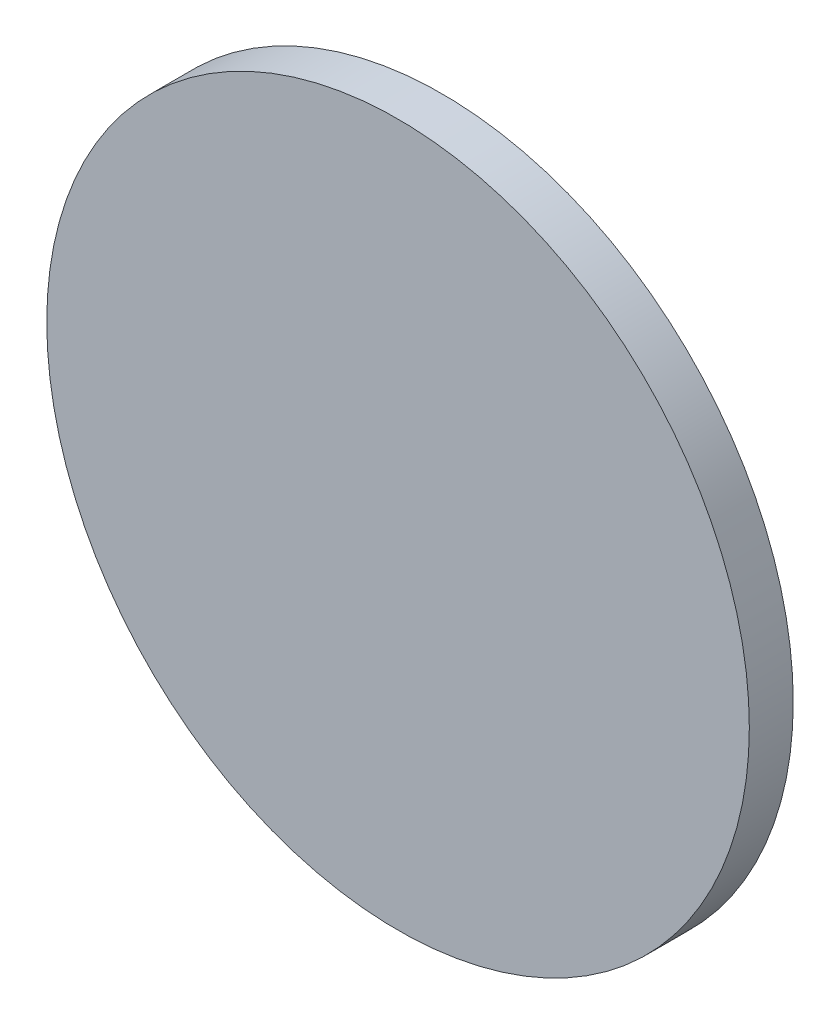
ISO-10303-21;
HEADER;
FILE_DESCRIPTION(('STEP AP214'),'2;1');
FILE_NAME('part.step','',(''),(''),'','','');
FILE_SCHEMA(('AUTOMOTIVE_DESIGN { 1 0 10303 214 1 1 1 1 }'));
ENDSEC;
DATA;
#1=APPLICATION_CONTEXT('core data for automotive mechanical design processes');
#2=APPLICATION_PROTOCOL_DEFINITION('international standard','automotive_design',2000,#1);
#3=PRODUCT_CONTEXT('',#1,'mechanical');
#4=PRODUCT('Part','Part','',(#3));
#5=PRODUCT_RELATED_PRODUCT_CATEGORY('part','',(#4));
#6=PRODUCT_DEFINITION_FORMATION('','',#4);
#7=PRODUCT_DEFINITION_CONTEXT('part definition',#1,'design');
#8=PRODUCT_DEFINITION('design','',#6,#7);
#9=PRODUCT_DEFINITION_SHAPE('','',#8);
#10=(LENGTH_UNIT() NAMED_UNIT(*) SI_UNIT(.MILLI.,.METRE.));
#11=(NAMED_UNIT(*) PLANE_ANGLE_UNIT() SI_UNIT($,.RADIAN.));
#12=(NAMED_UNIT(*) SI_UNIT($,.STERADIAN.) SOLID_ANGLE_UNIT());
#13=UNCERTAINTY_MEASURE_WITH_UNIT(LENGTH_MEASURE(1.E-05),#10,'distance_accuracy_value','');
#14=(GEOMETRIC_REPRESENTATION_CONTEXT(3) GLOBAL_UNCERTAINTY_ASSIGNED_CONTEXT((#13)) GLOBAL_UNIT_ASSIGNED_CONTEXT((#10,
#11,#12)) REPRESENTATION_CONTEXT('',''));
#15=CARTESIAN_POINT('',(0.,0.,0.));
#16=DIRECTION('',(0.,0.,1.));
#17=DIRECTION('',(1.,0.,0.));
#18=AXIS2_PLACEMENT_3D('',#15,#16,#17);
#19=CARTESIAN_POINT('',(0.,0.,1.5));
#20=DIRECTION('',(0.,0.,-1.));
#21=DIRECTION('',(-1.,0.,0.));
#22=AXIS2_PLACEMENT_3D('',#19,#20,#21);
#23=CYLINDRICAL_SURFACE('',#22,12.);
#24=CARTESIAN_POINT('',(0.,0.,1.5));
#25=DIRECTION('',(0.,0.,1.));
#26=DIRECTION('',(1.,0.,0.));
#27=AXIS2_PLACEMENT_3D('',#24,#25,#26);
#28=CIRCLE('',#27,12.);
#29=CARTESIAN_POINT('',(12.,0.,1.5));
#30=VERTEX_POINT('',#29);
#31=EDGE_CURVE('E10',#30,#30,#28,.T.);
#32=ORIENTED_EDGE('',*,*,#31,.F.);
#33=EDGE_LOOP('',(#32));
#34=FACE_BOUND('',#33,.T.);
#35=CARTESIAN_POINT('',(0.,0.,0.));
#36=DIRECTION('',(0.,0.,1.));
#37=DIRECTION('',(1.,0.,0.));
#38=AXIS2_PLACEMENT_3D('',#35,#36,#37);
#39=CIRCLE('',#38,12.);
#40=CARTESIAN_POINT('',(12.,0.,0.));
#41=VERTEX_POINT('',#40);
#42=EDGE_CURVE('E38',#41,#41,#39,.T.);
#43=ORIENTED_EDGE('',*,*,#42,.T.);
#44=EDGE_LOOP('',(#43));
#45=FACE_BOUND('',#44,.T.);
#46=ADVANCED_FACE('F35',(#34,#45),#23,.T.);
#47=CARTESIAN_POINT('',(0.,0.,1.5));
#48=DIRECTION('',(0.,0.,1.));
#49=DIRECTION('',(1.,0.,0.));
#50=AXIS2_PLACEMENT_3D('',#47,#48,#49);
#51=PLANE('',#50);
#52=ORIENTED_EDGE('',*,*,#31,.T.);
#53=EDGE_LOOP('',(#52));
#54=FACE_BOUND('',#53,.T.);
#55=ADVANCED_FACE('F50',(#54),#51,.T.);
#56=CARTESIAN_POINT('',(0.,0.,0.));
#57=DIRECTION('',(0.,0.,1.));
#58=DIRECTION('',(1.,0.,0.));
#59=AXIS2_PLACEMENT_3D('',#56,#57,#58);
#60=PLANE('',#59);
#61=ORIENTED_EDGE('',*,*,#42,.F.);
#62=EDGE_LOOP('',(#61));
#63=FACE_BOUND('',#62,.T.);
#64=ADVANCED_FACE('F48',(#63),#60,.F.);
#65=CLOSED_SHELL('',(#46,#55,#64));
#66=MANIFOLD_SOLID_BREP('B2',#65);
#67=ADVANCED_BREP_SHAPE_REPRESENTATION('',(#18,#66),#14);
#68=SHAPE_DEFINITION_REPRESENTATION(#9,#67);
ENDSEC;
END-ISO-10303-21;
